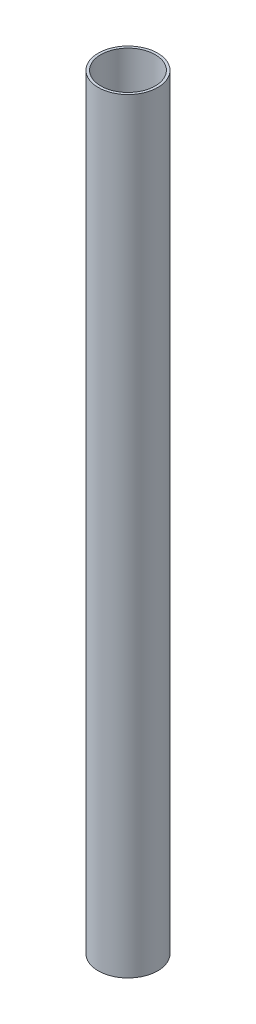
ISO-10303-21;
HEADER;
FILE_DESCRIPTION(('STEP AP214'),'2;1');
FILE_NAME('part.step','',(''),(''),'','','');
FILE_SCHEMA(('AUTOMOTIVE_DESIGN { 1 0 10303 214 1 1 1 1 }'));
ENDSEC;
DATA;
#1=APPLICATION_CONTEXT('core data for automotive mechanical design processes');
#2=APPLICATION_PROTOCOL_DEFINITION('international standard','automotive_design',2000,#1);
#3=PRODUCT_CONTEXT('',#1,'mechanical');
#4=PRODUCT('Part','Part','',(#3));
#5=PRODUCT_RELATED_PRODUCT_CATEGORY('part','',(#4));
#6=PRODUCT_DEFINITION_FORMATION('','',#4);
#7=PRODUCT_DEFINITION_CONTEXT('part definition',#1,'design');
#8=PRODUCT_DEFINITION('design','',#6,#7);
#9=PRODUCT_DEFINITION_SHAPE('','',#8);
#10=(LENGTH_UNIT() NAMED_UNIT(*) SI_UNIT(.MILLI.,.METRE.));
#11=(NAMED_UNIT(*) PLANE_ANGLE_UNIT() SI_UNIT($,.RADIAN.));
#12=(NAMED_UNIT(*) SI_UNIT($,.STERADIAN.) SOLID_ANGLE_UNIT());
#13=UNCERTAINTY_MEASURE_WITH_UNIT(LENGTH_MEASURE(1.E-05),#10,'distance_accuracy_value','');
#14=(GEOMETRIC_REPRESENTATION_CONTEXT(3) GLOBAL_UNCERTAINTY_ASSIGNED_CONTEXT((#13)) GLOBAL_UNIT_ASSIGNED_CONTEXT((#10,
#11,#12)) REPRESENTATION_CONTEXT('',''));
#15=CARTESIAN_POINT('',(0.,0.,0.));
#16=DIRECTION('',(0.,0.,1.));
#17=DIRECTION('',(1.,0.,0.));
#18=AXIS2_PLACEMENT_3D('',#15,#16,#17);
#19=CARTESIAN_POINT('',(0.,450.,0.));
#20=DIRECTION('',(0.,1.,0.));
#21=DIRECTION('',(0.,0.,1.));
#22=AXIS2_PLACEMENT_3D('',#19,#20,#21);
#23=PLANE('',#22);
#24=CARTESIAN_POINT('',(0.,450.,0.));
#25=DIRECTION('',(0.,1.,0.));
#26=DIRECTION('',(0.,0.,1.));
#27=AXIS2_PLACEMENT_3D('',#24,#25,#26);
#28=CIRCLE('',#27,17.5);
#29=CARTESIAN_POINT('',(0.,450.,17.5));
#30=VERTEX_POINT('',#29);
#31=EDGE_CURVE('E10',#30,#30,#28,.T.);
#32=ORIENTED_EDGE('',*,*,#31,.T.);
#33=EDGE_LOOP('',(#32));
#34=FACE_BOUND('',#33,.T.);
#35=CARTESIAN_POINT('',(0.,450.,0.));
#36=DIRECTION('',(0.,1.,0.));
#37=DIRECTION('',(0.,0.,1.));
#38=AXIS2_PLACEMENT_3D('',#35,#36,#37);
#39=CIRCLE('',#38,16.);
#40=CARTESIAN_POINT('',(0.,450.,16.));
#41=VERTEX_POINT('',#40);
#42=EDGE_CURVE('E46',#41,#41,#39,.T.);
#43=ORIENTED_EDGE('',*,*,#42,.F.);
#44=EDGE_LOOP('',(#43));
#45=FACE_BOUND('',#44,.T.);
#46=ADVANCED_FACE('F35',(#34,#45),#23,.T.);
#47=CARTESIAN_POINT('',(0.,0.,0.));
#48=DIRECTION('',(0.,1.,0.));
#49=DIRECTION('',(0.,0.,1.));
#50=AXIS2_PLACEMENT_3D('',#47,#48,#49);
#51=PLANE('',#50);
#52=CARTESIAN_POINT('',(0.,0.,0.));
#53=DIRECTION('',(0.,1.,0.));
#54=DIRECTION('',(0.,0.,1.));
#55=AXIS2_PLACEMENT_3D('',#52,#53,#54);
#56=CIRCLE('',#55,17.5);
#57=CARTESIAN_POINT('',(0.,0.,17.5));
#58=VERTEX_POINT('',#57);
#59=EDGE_CURVE('E39',#58,#58,#56,.T.);
#60=ORIENTED_EDGE('',*,*,#59,.F.);
#61=EDGE_LOOP('',(#60));
#62=FACE_BOUND('',#61,.T.);
#63=CARTESIAN_POINT('',(0.,0.,0.));
#64=DIRECTION('',(0.,1.,0.));
#65=DIRECTION('',(0.,0.,1.));
#66=AXIS2_PLACEMENT_3D('',#63,#64,#65);
#67=CIRCLE('',#66,16.);
#68=CARTESIAN_POINT('',(0.,0.,16.));
#69=VERTEX_POINT('',#68);
#70=EDGE_CURVE('E48',#69,#69,#67,.T.);
#71=ORIENTED_EDGE('',*,*,#70,.T.);
#72=EDGE_LOOP('',(#71));
#73=FACE_BOUND('',#72,.T.);
#74=ADVANCED_FACE('F58',(#62,#73),#51,.F.);
#75=CARTESIAN_POINT('',(0.,450.,0.));
#76=DIRECTION('',(0.,-1.,0.));
#77=DIRECTION('',(0.,0.,-1.));
#78=AXIS2_PLACEMENT_3D('',#75,#76,#77);
#79=CYLINDRICAL_SURFACE('',#78,17.5);
#80=ORIENTED_EDGE('',*,*,#31,.F.);
#81=EDGE_LOOP('',(#80));
#82=FACE_BOUND('',#81,.T.);
#83=ORIENTED_EDGE('',*,*,#59,.T.);
#84=EDGE_LOOP('',(#83));
#85=FACE_BOUND('',#84,.T.);
#86=ADVANCED_FACE('F37',(#82,#85),#79,.T.);
#87=CARTESIAN_POINT('',(0.,450.,0.));
#88=DIRECTION('',(0.,-1.,0.));
#89=DIRECTION('',(0.,0.,-1.));
#90=AXIS2_PLACEMENT_3D('',#87,#88,#89);
#91=CYLINDRICAL_SURFACE('',#90,16.);
#92=ORIENTED_EDGE('',*,*,#42,.T.);
#93=EDGE_LOOP('',(#92));
#94=FACE_BOUND('',#93,.T.);
#95=ORIENTED_EDGE('',*,*,#70,.F.);
#96=EDGE_LOOP('',(#95));
#97=FACE_BOUND('',#96,.T.);
#98=ADVANCED_FACE('F54',(#94,#97),#91,.F.);
#99=CLOSED_SHELL('',(#46,#74,#86,#98));
#100=MANIFOLD_SOLID_BREP('B2',#99);
#101=ADVANCED_BREP_SHAPE_REPRESENTATION('',(#18,#100),#14);
#102=SHAPE_DEFINITION_REPRESENTATION(#9,#101);
ENDSEC;
END-ISO-10303-21;
